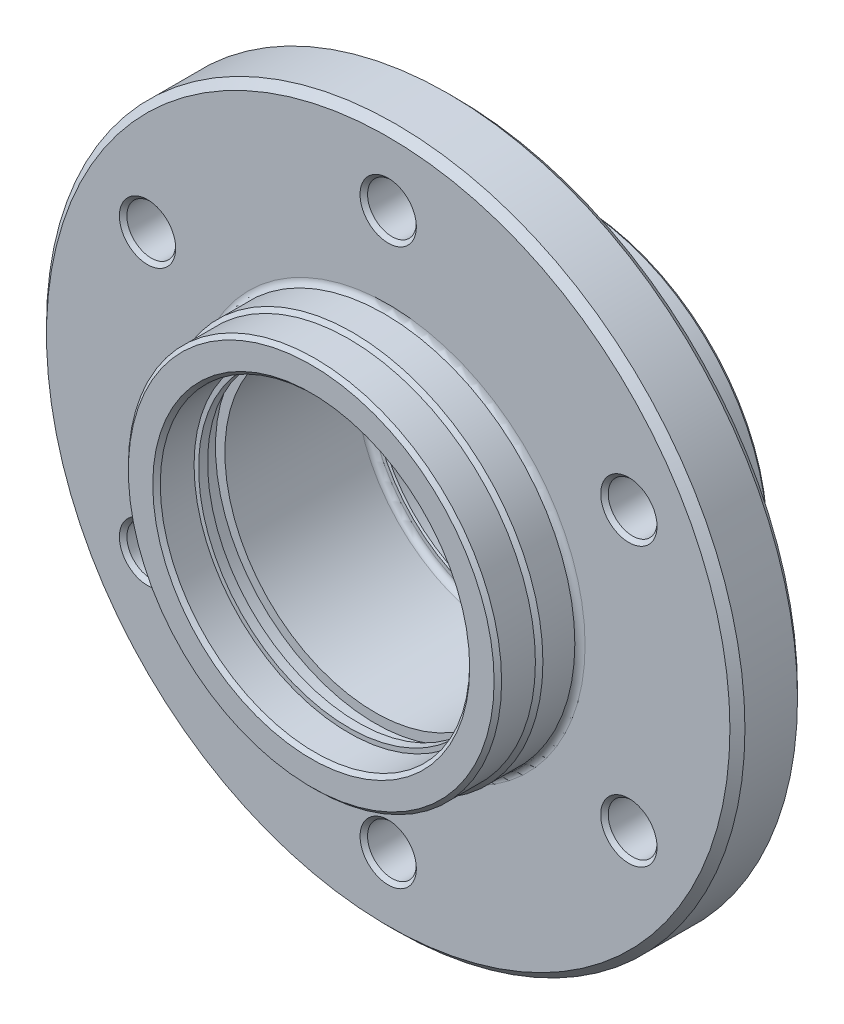
ISO-10303-21;
HEADER;
FILE_DESCRIPTION(('STEP AP214'),'2;1');
FILE_NAME('part.step','',(''),(''),'','','');
FILE_SCHEMA(('AUTOMOTIVE_DESIGN { 1 0 10303 214 1 1 1 1 }'));
ENDSEC;
DATA;
#1=APPLICATION_CONTEXT('core data for automotive mechanical design processes');
#2=APPLICATION_PROTOCOL_DEFINITION('international standard','automotive_design',2000,#1);
#3=PRODUCT_CONTEXT('',#1,'mechanical');
#4=PRODUCT('Part','Part','',(#3));
#5=PRODUCT_RELATED_PRODUCT_CATEGORY('part','',(#4));
#6=PRODUCT_DEFINITION_FORMATION('','',#4);
#7=PRODUCT_DEFINITION_CONTEXT('part definition',#1,'design');
#8=PRODUCT_DEFINITION('design','',#6,#7);
#9=PRODUCT_DEFINITION_SHAPE('','',#8);
#10=(LENGTH_UNIT() NAMED_UNIT(*) SI_UNIT(.MILLI.,.METRE.));
#11=(NAMED_UNIT(*) PLANE_ANGLE_UNIT() SI_UNIT($,.RADIAN.));
#12=(NAMED_UNIT(*) SI_UNIT($,.STERADIAN.) SOLID_ANGLE_UNIT());
#13=UNCERTAINTY_MEASURE_WITH_UNIT(LENGTH_MEASURE(1.E-05),#10,'distance_accuracy_value','');
#14=(GEOMETRIC_REPRESENTATION_CONTEXT(3) GLOBAL_UNCERTAINTY_ASSIGNED_CONTEXT((#13)) GLOBAL_UNIT_ASSIGNED_CONTEXT((#10,
#11,#12)) REPRESENTATION_CONTEXT('',''));
#15=CARTESIAN_POINT('',(0.,0.,0.));
#16=DIRECTION('',(0.,0.,1.));
#17=DIRECTION('',(1.,0.,0.));
#18=AXIS2_PLACEMENT_3D('',#15,#16,#17);
#19=CARTESIAN_POINT('',(0.,0.,9.));
#20=DIRECTION('',(0.,0.,1.));
#21=DIRECTION('',(1.,0.,0.));
#22=AXIS2_PLACEMENT_3D('',#19,#20,#21);
#23=PLANE('',#22);
#24=CARTESIAN_POINT('',(-32.0429399400237,18.4999999999991,9.));
#25=DIRECTION('',(0.,0.,1.));
#26=DIRECTION('',(1.,0.,0.));
#27=AXIS2_PLACEMENT_3D('',#24,#25,#26);
#28=CIRCLE('',#27,3.75000000000004);
#29=CARTESIAN_POINT('',(-28.2929399400237,18.4999999999991,9.));
#30=VERTEX_POINT('',#29);
#31=EDGE_CURVE('E10',#30,#30,#28,.F.);
#32=ORIENTED_EDGE('',*,*,#31,.T.);
#33=EDGE_LOOP('',(#32));
#34=FACE_BOUND('',#33,.T.);
#35=CARTESIAN_POINT('',(-32.0429399400226,-18.5000000000009,9.));
#36=DIRECTION('',(0.,0.,1.));
#37=DIRECTION('',(1.,0.,0.));
#38=AXIS2_PLACEMENT_3D('',#35,#36,#37);
#39=CIRCLE('',#38,3.75);
#40=CARTESIAN_POINT('',(-28.2929399400226,-18.5000000000009,9.));
#41=VERTEX_POINT('',#40);
#42=EDGE_CURVE('E40',#41,#41,#39,.F.);
#43=ORIENTED_EDGE('',*,*,#42,.T.);
#44=EDGE_LOOP('',(#43));
#45=FACE_BOUND('',#44,.T.);
#46=CARTESIAN_POINT('',(2.09414411153621E-12,-37.,9.));
#47=DIRECTION('',(0.,0.,1.));
#48=DIRECTION('',(1.,0.,0.));
#49=AXIS2_PLACEMENT_3D('',#46,#47,#48);
#50=CIRCLE('',#49,3.75);
#51=CARTESIAN_POINT('',(3.7500000000021,-37.,9.));
#52=VERTEX_POINT('',#51);
#53=EDGE_CURVE('E44',#52,#52,#50,.F.);
#54=ORIENTED_EDGE('',*,*,#53,.T.);
#55=EDGE_LOOP('',(#54));
#56=FACE_BOUND('',#55,.T.);
#57=CARTESIAN_POINT('',(32.0429399400258,-18.4999999999991,9.));
#58=DIRECTION('',(0.,0.,1.));
#59=DIRECTION('',(1.,0.,0.));
#60=AXIS2_PLACEMENT_3D('',#57,#58,#59);
#61=CIRCLE('',#60,3.74999999999999);
#62=CARTESIAN_POINT('',(35.7929399400258,-18.4999999999991,9.));
#63=VERTEX_POINT('',#62);
#64=EDGE_CURVE('E48',#63,#63,#61,.F.);
#65=ORIENTED_EDGE('',*,*,#64,.T.);
#66=EDGE_LOOP('',(#65));
#67=FACE_BOUND('',#66,.T.);
#68=CARTESIAN_POINT('',(32.0429399400247,18.5000000000009,9.));
#69=DIRECTION('',(0.,0.,1.));
#70=DIRECTION('',(1.,0.,0.));
#71=AXIS2_PLACEMENT_3D('',#68,#69,#70);
#72=CIRCLE('',#71,3.75000000000003);
#73=CARTESIAN_POINT('',(35.7929399400248,18.5000000000009,9.));
#74=VERTEX_POINT('',#73);
#75=EDGE_CURVE('E53',#74,#74,#72,.F.);
#76=ORIENTED_EDGE('',*,*,#75,.T.);
#77=EDGE_LOOP('',(#76));
#78=FACE_BOUND('',#77,.T.);
#79=CARTESIAN_POINT('',(0.,37.,9.));
#80=DIRECTION('',(0.,0.,1.));
#81=DIRECTION('',(1.,0.,0.));
#82=AXIS2_PLACEMENT_3D('',#79,#80,#81);
#83=CIRCLE('',#82,3.75);
#84=CARTESIAN_POINT('',(3.75,37.,9.));
#85=VERTEX_POINT('',#84);
#86=EDGE_CURVE('E56',#85,#85,#83,.F.);
#87=ORIENTED_EDGE('',*,*,#86,.T.);
#88=EDGE_LOOP('',(#87));
#89=FACE_BOUND('',#88,.T.);
#90=CARTESIAN_POINT('',(0.,0.,9.));
#91=DIRECTION('',(0.,0.,1.));
#92=DIRECTION('',(1.,0.,0.));
#93=AXIS2_PLACEMENT_3D('',#90,#91,#92);
#94=CIRCLE('',#93,45.5);
#95=CARTESIAN_POINT('',(45.5,0.,9.));
#96=VERTEX_POINT('',#95);
#97=EDGE_CURVE('E203',#96,#96,#94,.T.);
#98=ORIENTED_EDGE('',*,*,#97,.T.);
#99=EDGE_LOOP('',(#98));
#100=FACE_BOUND('',#99,.T.);
#101=CARTESIAN_POINT('',(0.,0.,9.));
#102=DIRECTION('',(0.,0.,1.));
#103=DIRECTION('',(1.,0.,0.));
#104=AXIS2_PLACEMENT_3D('',#101,#102,#103);
#105=CIRCLE('',#104,26.2160254037844);
#106=CARTESIAN_POINT('',(26.2160254037844,0.,9.));
#107=VERTEX_POINT('',#106);
#108=EDGE_CURVE('E113',#107,#107,#105,.T.);
#109=ORIENTED_EDGE('',*,*,#108,.F.);
#110=EDGE_LOOP('',(#109));
#111=FACE_BOUND('',#110,.T.);
#112=ADVANCED_FACE('F33',(#34,#45,#56,#67,#78,#89,#100,#111),#23,.T.);
#113=CARTESIAN_POINT('',(0.,0.,10.));
#114=DIRECTION('',(0.,0.,1.));
#115=DIRECTION('',(1.,0.,0.));
#116=AXIS2_PLACEMENT_3D('',#113,#114,#115);
#117=TOROIDAL_SURFACE('',#116,26.2160254037844,1.);
#118=CARTESIAN_POINT('',(0.,0.,9.50000000000002));
#119=DIRECTION('',(0.,0.,1.));
#120=DIRECTION('',(1.,0.,0.));
#121=AXIS2_PLACEMENT_3D('',#118,#119,#120);
#122=CIRCLE('',#121,25.35);
#123=CARTESIAN_POINT('',(25.35,0.,9.50000000000002));
#124=VERTEX_POINT('',#123);
#125=EDGE_CURVE('E116',#124,#124,#122,.T.);
#126=ORIENTED_EDGE('',*,*,#125,.F.);
#127=EDGE_LOOP('',(#126));
#128=FACE_BOUND('',#127,.T.);
#129=ORIENTED_EDGE('',*,*,#108,.T.);
#130=EDGE_LOOP('',(#129));
#131=FACE_BOUND('',#130,.T.);
#132=ADVANCED_FACE('F227',(#128,#131),#117,.F.);
#133=CARTESIAN_POINT('',(0.,0.,23.3026411808121));
#134=DIRECTION('',(0.,0.,1.));
#135=DIRECTION('',(1.,0.,0.));
#136=AXIS2_PLACEMENT_3D('',#133,#134,#135);
#137=CYLINDRICAL_SURFACE('',#136,25.35);
#138=ORIENTED_EDGE('',*,*,#125,.T.);
#139=EDGE_LOOP('',(#138));
#140=FACE_BOUND('',#139,.T.);
#141=CARTESIAN_POINT('',(0.,0.,13.75));
#142=DIRECTION('',(0.,0.,1.));
#143=DIRECTION('',(1.,0.,0.));
#144=AXIS2_PLACEMENT_3D('',#141,#142,#143);
#145=CIRCLE('',#144,25.35);
#146=CARTESIAN_POINT('',(25.35,0.,13.75));
#147=VERTEX_POINT('',#146);
#148=EDGE_CURVE('E119',#147,#147,#145,.T.);
#149=ORIENTED_EDGE('',*,*,#148,.F.);
#150=EDGE_LOOP('',(#149));
#151=FACE_BOUND('',#150,.T.);
#152=ADVANCED_FACE('F232',(#140,#151),#137,.T.);
#153=CARTESIAN_POINT('',(0.,0.,13.75));
#154=DIRECTION('',(0.,0.,-1.));
#155=DIRECTION('',(-1.,0.,0.));
#156=AXIS2_PLACEMENT_3D('',#153,#154,#155);
#157=CONICAL_SURFACE('',#156,25.35,0.785398163397445);
#158=CARTESIAN_POINT('',(0.,0.,14.25));
#159=DIRECTION('',(0.,0.,1.));
#160=DIRECTION('',(1.,0.,0.));
#161=AXIS2_PLACEMENT_3D('',#158,#159,#160);
#162=CIRCLE('',#161,24.85);
#163=CARTESIAN_POINT('',(24.85,0.,14.25));
#164=VERTEX_POINT('',#163);
#165=EDGE_CURVE('E122',#164,#164,#162,.T.);
#166=ORIENTED_EDGE('',*,*,#165,.F.);
#167=EDGE_LOOP('',(#166));
#168=FACE_BOUND('',#167,.T.);
#169=ORIENTED_EDGE('',*,*,#148,.T.);
#170=EDGE_LOOP('',(#169));
#171=FACE_BOUND('',#170,.T.);
#172=ADVANCED_FACE('F651',(#168,#171),#157,.T.);
#173=CARTESIAN_POINT('',(0.,0.,23.3026411808121));
#174=DIRECTION('',(0.,0.,1.));
#175=DIRECTION('',(1.,0.,0.));
#176=AXIS2_PLACEMENT_3D('',#173,#174,#175);
#177=CYLINDRICAL_SURFACE('',#176,24.85);
#178=CARTESIAN_POINT('',(0.,0.,18.75));
#179=DIRECTION('',(0.,0.,1.));
#180=DIRECTION('',(1.,0.,0.));
#181=AXIS2_PLACEMENT_3D('',#178,#179,#180);
#182=CIRCLE('',#181,24.85);
#183=CARTESIAN_POINT('',(24.85,0.,18.75));
#184=VERTEX_POINT('',#183);
#185=EDGE_CURVE('E125',#184,#184,#182,.T.);
#186=ORIENTED_EDGE('',*,*,#185,.F.);
#187=EDGE_LOOP('',(#186));
#188=FACE_BOUND('',#187,.T.);
#189=ORIENTED_EDGE('',*,*,#165,.T.);
#190=EDGE_LOOP('',(#189));
#191=FACE_BOUND('',#190,.T.);
#192=ADVANCED_FACE('F642',(#188,#191),#177,.T.);
#193=CARTESIAN_POINT('',(0.,0.,18.75));
#194=DIRECTION('',(0.,0.,-1.));
#195=DIRECTION('',(-1.,0.,0.));
#196=AXIS2_PLACEMENT_3D('',#193,#194,#195);
#197=CONICAL_SURFACE('',#196,24.85,0.785398163397448);
#198=CARTESIAN_POINT('',(0.,0.,19.25));
#199=DIRECTION('',(0.,0.,1.));
#200=DIRECTION('',(1.,0.,0.));
#201=AXIS2_PLACEMENT_3D('',#198,#199,#200);
#202=CIRCLE('',#201,24.35);
#203=CARTESIAN_POINT('',(24.35,0.,19.25));
#204=VERTEX_POINT('',#203);
#205=EDGE_CURVE('E128',#204,#204,#202,.T.);
#206=ORIENTED_EDGE('',*,*,#205,.F.);
#207=EDGE_LOOP('',(#206));
#208=FACE_BOUND('',#207,.T.);
#209=ORIENTED_EDGE('',*,*,#185,.T.);
#210=EDGE_LOOP('',(#209));
#211=FACE_BOUND('',#210,.T.);
#212=ADVANCED_FACE('F633',(#208,#211),#197,.T.);
#213=CARTESIAN_POINT('',(0.,0.,19.25));
#214=DIRECTION('',(0.,0.,1.));
#215=DIRECTION('',(1.,0.,0.));
#216=AXIS2_PLACEMENT_3D('',#213,#214,#215);
#217=PLANE('',#216);
#218=ORIENTED_EDGE('',*,*,#205,.T.);
#219=EDGE_LOOP('',(#218));
#220=FACE_BOUND('',#219,.T.);
#221=CARTESIAN_POINT('',(0.,0.,19.25));
#222=DIRECTION('',(0.,0.,1.));
#223=DIRECTION('',(1.,0.,0.));
#224=AXIS2_PLACEMENT_3D('',#221,#222,#223);
#225=CIRCLE('',#224,21.1);
#226=CARTESIAN_POINT('',(21.1,0.,19.25));
#227=VERTEX_POINT('',#226);
#228=EDGE_CURVE('E131',#227,#227,#225,.T.);
#229=ORIENTED_EDGE('',*,*,#228,.F.);
#230=EDGE_LOOP('',(#229));
#231=FACE_BOUND('',#230,.T.);
#232=ADVANCED_FACE('F624',(#220,#231),#217,.T.);
#233=CARTESIAN_POINT('',(0.,0.,18.75));
#234=DIRECTION('',(0.,0.,1.));
#235=DIRECTION('',(1.,0.,0.));
#236=AXIS2_PLACEMENT_3D('',#233,#234,#235);
#237=CONICAL_SURFACE('',#236,20.6,0.785398163397448);
#238=ORIENTED_EDGE('',*,*,#228,.T.);
#239=EDGE_LOOP('',(#238));
#240=FACE_BOUND('',#239,.T.);
#241=CARTESIAN_POINT('',(0.,0.,18.75));
#242=DIRECTION('',(0.,0.,1.));
#243=DIRECTION('',(1.,0.,0.));
#244=AXIS2_PLACEMENT_3D('',#241,#242,#243);
#245=CIRCLE('',#244,20.6);
#246=CARTESIAN_POINT('',(20.6,0.,18.75));
#247=VERTEX_POINT('',#246);
#248=EDGE_CURVE('E134',#247,#247,#245,.T.);
#249=ORIENTED_EDGE('',*,*,#248,.F.);
#250=EDGE_LOOP('',(#249));
#251=FACE_BOUND('',#250,.T.);
#252=ADVANCED_FACE('F615',(#240,#251),#237,.F.);
#253=CARTESIAN_POINT('',(0.,0.,23.3026411808121));
#254=DIRECTION('',(0.,0.,1.));
#255=DIRECTION('',(1.,0.,0.));
#256=AXIS2_PLACEMENT_3D('',#253,#254,#255);
#257=CYLINDRICAL_SURFACE('',#256,20.6);
#258=ORIENTED_EDGE('',*,*,#248,.T.);
#259=EDGE_LOOP('',(#258));
#260=FACE_BOUND('',#259,.T.);
#261=CARTESIAN_POINT('',(0.,0.,14.25));
#262=DIRECTION('',(0.,0.,1.));
#263=DIRECTION('',(1.,0.,0.));
#264=AXIS2_PLACEMENT_3D('',#261,#262,#263);
#265=CIRCLE('',#264,20.6);
#266=CARTESIAN_POINT('',(20.6,0.,14.25));
#267=VERTEX_POINT('',#266);
#268=EDGE_CURVE('E137',#267,#267,#265,.T.);
#269=ORIENTED_EDGE('',*,*,#268,.F.);
#270=EDGE_LOOP('',(#269));
#271=FACE_BOUND('',#270,.T.);
#272=ADVANCED_FACE('F606',(#260,#271),#257,.F.);
#273=CARTESIAN_POINT('',(0.,0.,14.25));
#274=DIRECTION('',(0.,0.,1.));
#275=DIRECTION('',(1.,0.,0.));
#276=AXIS2_PLACEMENT_3D('',#273,#274,#275);
#277=PLANE('',#276);
#278=ORIENTED_EDGE('',*,*,#268,.T.);
#279=EDGE_LOOP('',(#278));
#280=FACE_BOUND('',#279,.T.);
#281=CARTESIAN_POINT('',(0.,0.,14.25));
#282=DIRECTION('',(0.,0.,1.));
#283=DIRECTION('',(1.,0.,0.));
#284=AXIS2_PLACEMENT_3D('',#281,#282,#283);
#285=CIRCLE('',#284,20.);
#286=CARTESIAN_POINT('',(20.,0.,14.25));
#287=VERTEX_POINT('',#286);
#288=EDGE_CURVE('E140',#287,#287,#285,.T.);
#289=ORIENTED_EDGE('',*,*,#288,.F.);
#290=EDGE_LOOP('',(#289));
#291=FACE_BOUND('',#290,.T.);
#292=ADVANCED_FACE('F597',(#280,#291),#277,.T.);
#293=CARTESIAN_POINT('',(0.,0.,23.3026411808121));
#294=DIRECTION('',(0.,0.,1.));
#295=DIRECTION('',(1.,0.,0.));
#296=AXIS2_PLACEMENT_3D('',#293,#294,#295);
#297=CYLINDRICAL_SURFACE('',#296,20.);
#298=CARTESIAN_POINT('',(0.,0.,13.05));
#299=DIRECTION('',(0.,0.,1.));
#300=DIRECTION('',(1.,0.,0.));
#301=AXIS2_PLACEMENT_3D('',#298,#299,#300);
#302=CIRCLE('',#301,20.);
#303=CARTESIAN_POINT('',(20.,0.,13.05));
#304=VERTEX_POINT('',#303);
#305=EDGE_CURVE('E143',#304,#304,#302,.T.);
#306=ORIENTED_EDGE('',*,*,#305,.F.);
#307=EDGE_LOOP('',(#306));
#308=FACE_BOUND('',#307,.T.);
#309=ORIENTED_EDGE('',*,*,#288,.T.);
#310=EDGE_LOOP('',(#309));
#311=FACE_BOUND('',#310,.T.);
#312=ADVANCED_FACE('F588',(#308,#311),#297,.F.);
#313=CARTESIAN_POINT('',(0.,0.,13.05));
#314=DIRECTION('',(0.,0.,1.));
#315=DIRECTION('',(1.,0.,0.));
#316=AXIS2_PLACEMENT_3D('',#313,#314,#315);
#317=PLANE('',#316);
#318=CARTESIAN_POINT('',(0.,0.,13.05));
#319=DIRECTION('',(0.,0.,1.));
#320=DIRECTION('',(1.,0.,0.));
#321=AXIS2_PLACEMENT_3D('',#318,#319,#320);
#322=CIRCLE('',#321,21.25);
#323=CARTESIAN_POINT('',(21.25,0.,13.05));
#324=VERTEX_POINT('',#323);
#325=EDGE_CURVE('E146',#324,#324,#322,.T.);
#326=ORIENTED_EDGE('',*,*,#325,.F.);
#327=EDGE_LOOP('',(#326));
#328=FACE_BOUND('',#327,.T.);
#329=ORIENTED_EDGE('',*,*,#305,.T.);
#330=EDGE_LOOP('',(#329));
#331=FACE_BOUND('',#330,.T.);
#332=ADVANCED_FACE('F579',(#328,#331),#317,.F.);
#333=CARTESIAN_POINT('',(0.,0.,23.3026411808121));
#334=DIRECTION('',(0.,0.,1.));
#335=DIRECTION('',(1.,0.,0.));
#336=AXIS2_PLACEMENT_3D('',#333,#334,#335);
#337=CYLINDRICAL_SURFACE('',#336,21.25);
#338=CARTESIAN_POINT('',(0.,0.,10.75));
#339=DIRECTION('',(0.,0.,1.));
#340=DIRECTION('',(1.,0.,0.));
#341=AXIS2_PLACEMENT_3D('',#338,#339,#340);
#342=CIRCLE('',#341,21.25);
#343=CARTESIAN_POINT('',(21.25,0.,10.75));
#344=VERTEX_POINT('',#343);
#345=EDGE_CURVE('E149',#344,#344,#342,.T.);
#346=ORIENTED_EDGE('',*,*,#345,.F.);
#347=EDGE_LOOP('',(#346));
#348=FACE_BOUND('',#347,.T.);
#349=ORIENTED_EDGE('',*,*,#325,.T.);
#350=EDGE_LOOP('',(#349));
#351=FACE_BOUND('',#350,.T.);
#352=ADVANCED_FACE('F570',(#348,#351),#337,.F.);
#353=CARTESIAN_POINT('',(0.,0.,10.75));
#354=DIRECTION('',(0.,0.,-1.));
#355=DIRECTION('',(-1.,0.,0.));
#356=AXIS2_PLACEMENT_3D('',#353,#354,#355);
#357=PLANE('',#356);
#358=CARTESIAN_POINT('',(0.,0.,10.75));
#359=DIRECTION('',(0.,0.,1.));
#360=DIRECTION('',(1.,0.,0.));
#361=AXIS2_PLACEMENT_3D('',#358,#359,#360);
#362=CIRCLE('',#361,20.);
#363=CARTESIAN_POINT('',(20.,0.,10.75));
#364=VERTEX_POINT('',#363);
#365=EDGE_CURVE('E152',#364,#364,#362,.T.);
#366=ORIENTED_EDGE('',*,*,#365,.F.);
#367=EDGE_LOOP('',(#366));
#368=FACE_BOUND('',#367,.T.);
#369=ORIENTED_EDGE('',*,*,#345,.T.);
#370=EDGE_LOOP('',(#369));
#371=FACE_BOUND('',#370,.T.);
#372=ADVANCED_FACE('F561',(#368,#371),#357,.F.);
#373=CARTESIAN_POINT('',(0.,0.,23.3026411808121));
#374=DIRECTION('',(0.,0.,1.));
#375=DIRECTION('',(1.,0.,0.));
#376=AXIS2_PLACEMENT_3D('',#373,#374,#375);
#377=CYLINDRICAL_SURFACE('',#376,20.);
#378=CARTESIAN_POINT('',(0.,0.,-6.65));
#379=DIRECTION('',(0.,0.,1.));
#380=DIRECTION('',(1.,0.,0.));
#381=AXIS2_PLACEMENT_3D('',#378,#379,#380);
#382=CIRCLE('',#381,20.);
#383=CARTESIAN_POINT('',(20.,0.,-6.65));
#384=VERTEX_POINT('',#383);
#385=EDGE_CURVE('E155',#384,#384,#382,.T.);
#386=ORIENTED_EDGE('',*,*,#385,.F.);
#387=EDGE_LOOP('',(#386));
#388=FACE_BOUND('',#387,.T.);
#389=ORIENTED_EDGE('',*,*,#365,.T.);
#390=EDGE_LOOP('',(#389));
#391=FACE_BOUND('',#390,.T.);
#392=ADVANCED_FACE('F552',(#388,#391),#377,.F.);
#393=CARTESIAN_POINT('',(0.,0.,-6.65));
#394=DIRECTION('',(0.,0.,1.));
#395=DIRECTION('',(1.,0.,0.));
#396=AXIS2_PLACEMENT_3D('',#393,#394,#395);
#397=TOROIDAL_SURFACE('',#396,19.2,0.799999999999998);
#398=ORIENTED_EDGE('',*,*,#385,.T.);
#399=EDGE_LOOP('',(#398));
#400=FACE_BOUND('',#399,.T.);
#401=CARTESIAN_POINT('',(0.,0.,-7.45));
#402=DIRECTION('',(0.,0.,1.));
#403=DIRECTION('',(1.,0.,0.));
#404=AXIS2_PLACEMENT_3D('',#401,#402,#403);
#405=CIRCLE('',#404,19.2);
#406=CARTESIAN_POINT('',(19.2,0.,-7.45));
#407=VERTEX_POINT('',#406);
#408=EDGE_CURVE('E158',#407,#407,#405,.T.);
#409=ORIENTED_EDGE('',*,*,#408,.F.);
#410=EDGE_LOOP('',(#409));
#411=FACE_BOUND('',#410,.T.);
#412=ADVANCED_FACE('F543',(#400,#411),#397,.F.);
#413=CARTESIAN_POINT('',(0.,0.,-7.45));
#414=DIRECTION('',(0.,0.,1.));
#415=DIRECTION('',(1.,0.,0.));
#416=AXIS2_PLACEMENT_3D('',#413,#414,#415);
#417=PLANE('',#416);
#418=ORIENTED_EDGE('',*,*,#408,.T.);
#419=EDGE_LOOP('',(#418));
#420=FACE_BOUND('',#419,.T.);
#421=CARTESIAN_POINT('',(0.,0.,-7.45));
#422=DIRECTION('',(0.,0.,1.));
#423=DIRECTION('',(1.,0.,0.));
#424=AXIS2_PLACEMENT_3D('',#421,#422,#423);
#425=CIRCLE('',#424,18.7);
#426=CARTESIAN_POINT('',(18.7,0.,-7.45));
#427=VERTEX_POINT('',#426);
#428=EDGE_CURVE('E161',#427,#427,#425,.T.);
#429=ORIENTED_EDGE('',*,*,#428,.F.);
#430=EDGE_LOOP('',(#429));
#431=FACE_BOUND('',#430,.T.);
#432=ADVANCED_FACE('F534',(#420,#431),#417,.T.);
#433=CARTESIAN_POINT('',(0.,0.,-7.45));
#434=DIRECTION('',(0.,0.,1.));
#435=DIRECTION('',(1.,0.,0.));
#436=AXIS2_PLACEMENT_3D('',#433,#434,#435);
#437=CONICAL_SURFACE('',#436,18.7,0.785398163397448);
#438=CARTESIAN_POINT('',(0.,0.,-7.65));
#439=DIRECTION('',(0.,0.,1.));
#440=DIRECTION('',(1.,0.,0.));
#441=AXIS2_PLACEMENT_3D('',#438,#439,#440);
#442=CIRCLE('',#441,18.5);
#443=CARTESIAN_POINT('',(18.5,0.,-7.65));
#444=VERTEX_POINT('',#443);
#445=EDGE_CURVE('E164',#444,#444,#442,.T.);
#446=ORIENTED_EDGE('',*,*,#445,.F.);
#447=EDGE_LOOP('',(#446));
#448=FACE_BOUND('',#447,.T.);
#449=ORIENTED_EDGE('',*,*,#428,.T.);
#450=EDGE_LOOP('',(#449));
#451=FACE_BOUND('',#450,.T.);
#452=ADVANCED_FACE('F525',(#448,#451),#437,.F.);
#453=CARTESIAN_POINT('',(0.,0.,23.3026411808121));
#454=DIRECTION('',(0.,0.,1.));
#455=DIRECTION('',(1.,0.,0.));
#456=AXIS2_PLACEMENT_3D('',#453,#454,#455);
#457=CYLINDRICAL_SURFACE('',#456,18.5);
#458=CARTESIAN_POINT('',(0.,0.,-10.75));
#459=DIRECTION('',(0.,0.,1.));
#460=DIRECTION('',(1.,0.,0.));
#461=AXIS2_PLACEMENT_3D('',#458,#459,#460);
#462=CIRCLE('',#461,18.5);
#463=CARTESIAN_POINT('',(18.5,0.,-10.75));
#464=VERTEX_POINT('',#463);
#465=EDGE_CURVE('E167',#464,#464,#462,.T.);
#466=ORIENTED_EDGE('',*,*,#465,.F.);
#467=EDGE_LOOP('',(#466));
#468=FACE_BOUND('',#467,.T.);
#469=ORIENTED_EDGE('',*,*,#445,.T.);
#470=EDGE_LOOP('',(#469));
#471=FACE_BOUND('',#470,.T.);
#472=ADVANCED_FACE('F516',(#468,#471),#457,.F.);
#473=CARTESIAN_POINT('',(0.,0.,-10.95));
#474=DIRECTION('',(0.,0.,-1.));
#475=DIRECTION('',(-1.,0.,0.));
#476=AXIS2_PLACEMENT_3D('',#473,#474,#475);
#477=CONICAL_SURFACE('',#476,18.7,0.785398163397396);
#478=ORIENTED_EDGE('',*,*,#465,.T.);
#479=EDGE_LOOP('',(#478));
#480=FACE_BOUND('',#479,.T.);
#481=CARTESIAN_POINT('',(0.,0.,-10.95));
#482=DIRECTION('',(0.,0.,1.));
#483=DIRECTION('',(1.,0.,0.));
#484=AXIS2_PLACEMENT_3D('',#481,#482,#483);
#485=CIRCLE('',#484,18.7);
#486=CARTESIAN_POINT('',(18.7,0.,-10.95));
#487=VERTEX_POINT('',#486);
#488=EDGE_CURVE('E170',#487,#487,#485,.T.);
#489=ORIENTED_EDGE('',*,*,#488,.F.);
#490=EDGE_LOOP('',(#489));
#491=FACE_BOUND('',#490,.T.);
#492=ADVANCED_FACE('F507',(#480,#491),#477,.F.);
#493=CARTESIAN_POINT('',(0.,0.,-10.95));
#494=DIRECTION('',(0.,0.,1.));
#495=DIRECTION('',(1.,0.,0.));
#496=AXIS2_PLACEMENT_3D('',#493,#494,#495);
#497=PLANE('',#496);
#498=CARTESIAN_POINT('',(0.,0.,-10.95));
#499=DIRECTION('',(0.,0.,1.));
#500=DIRECTION('',(1.,0.,0.));
#501=AXIS2_PLACEMENT_3D('',#498,#499,#500);
#502=CIRCLE('',#501,20.6);
#503=CARTESIAN_POINT('',(20.6,0.,-10.95));
#504=VERTEX_POINT('',#503);
#505=EDGE_CURVE('E173',#504,#504,#502,.T.);
#506=ORIENTED_EDGE('',*,*,#505,.F.);
#507=EDGE_LOOP('',(#506));
#508=FACE_BOUND('',#507,.T.);
#509=ORIENTED_EDGE('',*,*,#488,.T.);
#510=EDGE_LOOP('',(#509));
#511=FACE_BOUND('',#510,.T.);
#512=ADVANCED_FACE('F498',(#508,#511),#497,.F.);
#513=CARTESIAN_POINT('',(0.,0.,23.3026411808121));
#514=DIRECTION('',(0.,0.,1.));
#515=DIRECTION('',(1.,0.,0.));
#516=AXIS2_PLACEMENT_3D('',#513,#514,#515);
#517=CYLINDRICAL_SURFACE('',#516,20.6);
#518=CARTESIAN_POINT('',(0.,0.,-15.45));
#519=DIRECTION('',(0.,0.,1.));
#520=DIRECTION('',(1.,0.,0.));
#521=AXIS2_PLACEMENT_3D('',#518,#519,#520);
#522=CIRCLE('',#521,20.6);
#523=CARTESIAN_POINT('',(20.6,0.,-15.45));
#524=VERTEX_POINT('',#523);
#525=EDGE_CURVE('E176',#524,#524,#522,.T.);
#526=ORIENTED_EDGE('',*,*,#525,.F.);
#527=EDGE_LOOP('',(#526));
#528=FACE_BOUND('',#527,.T.);
#529=ORIENTED_EDGE('',*,*,#505,.T.);
#530=EDGE_LOOP('',(#529));
#531=FACE_BOUND('',#530,.T.);
#532=ADVANCED_FACE('F489',(#528,#531),#517,.F.);
#533=CARTESIAN_POINT('',(0.,0.,-15.45));
#534=DIRECTION('',(0.,0.,-1.));
#535=DIRECTION('',(-1.,0.,0.));
#536=AXIS2_PLACEMENT_3D('',#533,#534,#535);
#537=CONICAL_SURFACE('',#536,20.6,0.785398163397445);
#538=CARTESIAN_POINT('',(0.,0.,-15.95));
#539=DIRECTION('',(0.,0.,1.));
#540=DIRECTION('',(1.,0.,0.));
#541=AXIS2_PLACEMENT_3D('',#538,#539,#540);
#542=CIRCLE('',#541,21.1);
#543=CARTESIAN_POINT('',(21.1,0.,-15.95));
#544=VERTEX_POINT('',#543);
#545=EDGE_CURVE('E179',#544,#544,#542,.T.);
#546=ORIENTED_EDGE('',*,*,#545,.F.);
#547=EDGE_LOOP('',(#546));
#548=FACE_BOUND('',#547,.T.);
#549=ORIENTED_EDGE('',*,*,#525,.T.);
#550=EDGE_LOOP('',(#549));
#551=FACE_BOUND('',#550,.T.);
#552=ADVANCED_FACE('F480',(#548,#551),#537,.F.);
#553=CARTESIAN_POINT('',(0.,0.,-15.95));
#554=DIRECTION('',(0.,0.,1.));
#555=DIRECTION('',(1.,0.,0.));
#556=AXIS2_PLACEMENT_3D('',#553,#554,#555);
#557=PLANE('',#556);
#558=CARTESIAN_POINT('',(0.,0.,-15.95));
#559=DIRECTION('',(0.,0.,1.));
#560=DIRECTION('',(1.,0.,0.));
#561=AXIS2_PLACEMENT_3D('',#558,#559,#560);
#562=CIRCLE('',#561,25.5);
#563=CARTESIAN_POINT('',(25.5,0.,-15.95));
#564=VERTEX_POINT('',#563);
#565=EDGE_CURVE('E182',#564,#564,#562,.T.);
#566=ORIENTED_EDGE('',*,*,#565,.F.);
#567=EDGE_LOOP('',(#566));
#568=FACE_BOUND('',#567,.T.);
#569=ORIENTED_EDGE('',*,*,#545,.T.);
#570=EDGE_LOOP('',(#569));
#571=FACE_BOUND('',#570,.T.);
#572=ADVANCED_FACE('F471',(#568,#571),#557,.F.);
#573=CARTESIAN_POINT('',(0.,0.,-15.45));
#574=DIRECTION('',(0.,0.,1.));
#575=DIRECTION('',(1.,0.,0.));
#576=AXIS2_PLACEMENT_3D('',#573,#574,#575);
#577=CONICAL_SURFACE('',#576,26.,0.785398163397448);
#578=ORIENTED_EDGE('',*,*,#565,.T.);
#579=EDGE_LOOP('',(#578));
#580=FACE_BOUND('',#579,.T.);
#581=CARTESIAN_POINT('',(0.,0.,-15.45));
#582=DIRECTION('',(0.,0.,1.));
#583=DIRECTION('',(1.,0.,0.));
#584=AXIS2_PLACEMENT_3D('',#581,#582,#583);
#585=CIRCLE('',#584,26.);
#586=CARTESIAN_POINT('',(26.,0.,-15.45));
#587=VERTEX_POINT('',#586);
#588=EDGE_CURVE('E185',#587,#587,#585,.T.);
#589=ORIENTED_EDGE('',*,*,#588,.F.);
#590=EDGE_LOOP('',(#589));
#591=FACE_BOUND('',#590,.T.);
#592=ADVANCED_FACE('F462',(#580,#591),#577,.T.);
#593=CARTESIAN_POINT('',(0.,0.,23.3026411808121));
#594=DIRECTION('',(0.,0.,1.));
#595=DIRECTION('',(1.,0.,0.));
#596=AXIS2_PLACEMENT_3D('',#593,#594,#595);
#597=CYLINDRICAL_SURFACE('',#596,26.);
#598=ORIENTED_EDGE('',*,*,#588,.T.);
#599=EDGE_LOOP('',(#598));
#600=FACE_BOUND('',#599,.T.);
#601=CARTESIAN_POINT('',(0.,0.,-0.600000000000003));
#602=DIRECTION('',(0.,0.,1.));
#603=DIRECTION('',(1.,0.,0.));
#604=AXIS2_PLACEMENT_3D('',#601,#602,#603);
#605=CIRCLE('',#604,26.);
#606=CARTESIAN_POINT('',(26.,0.,-0.600000000000003));
#607=VERTEX_POINT('',#606);
#608=EDGE_CURVE('E188',#607,#607,#605,.T.);
#609=ORIENTED_EDGE('',*,*,#608,.F.);
#610=EDGE_LOOP('',(#609));
#611=FACE_BOUND('',#610,.T.);
#612=ADVANCED_FACE('F453',(#600,#611),#597,.T.);
#613=CARTESIAN_POINT('',(0.,0.,-0.300000000000002));
#614=DIRECTION('',(0.,0.,1.));
#615=DIRECTION('',(1.,0.,0.));
#616=AXIS2_PLACEMENT_3D('',#613,#614,#615);
#617=TOROIDAL_SURFACE('',#616,26.,0.3);
#618=ORIENTED_EDGE('',*,*,#608,.T.);
#619=EDGE_LOOP('',(#618));
#620=FACE_BOUND('',#619,.T.);
#621=CARTESIAN_POINT('',(0.,0.,0.));
#622=DIRECTION('',(0.,0.,1.));
#623=DIRECTION('',(1.,0.,0.));
#624=AXIS2_PLACEMENT_3D('',#621,#622,#623);
#625=CIRCLE('',#624,26.);
#626=CARTESIAN_POINT('',(26.,0.,0.));
#627=VERTEX_POINT('',#626);
#628=EDGE_CURVE('E191',#627,#627,#625,.T.);
#629=ORIENTED_EDGE('',*,*,#628,.F.);
#630=EDGE_LOOP('',(#629));
#631=FACE_BOUND('',#630,.T.);
#632=ADVANCED_FACE('F445',(#620,#631),#617,.F.);
#633=CARTESIAN_POINT('',(0.,0.,0.));
#634=DIRECTION('',(0.,0.,-1.));
#635=DIRECTION('',(-1.,0.,0.));
#636=AXIS2_PLACEMENT_3D('',#633,#634,#635);
#637=PLANE('',#636);
#638=CARTESIAN_POINT('',(-32.0429399400226,-18.5000000000009,0.));
#639=DIRECTION('',(0.,0.,-1.));
#640=DIRECTION('',(-1.,0.,0.));
#641=AXIS2_PLACEMENT_3D('',#638,#639,#640);
#642=CIRCLE('',#641,3.75000000000001);
#643=CARTESIAN_POINT('',(-35.7929399400227,-18.5000000000009,0.));
#644=VERTEX_POINT('',#643);
#645=EDGE_CURVE('E89',#644,#644,#642,.F.);
#646=ORIENTED_EDGE('',*,*,#645,.T.);
#647=EDGE_LOOP('',(#646));
#648=FACE_BOUND('',#647,.T.);
#649=CARTESIAN_POINT('',(2.09414411153621E-12,-37.,0.));
#650=DIRECTION('',(0.,0.,-1.));
#651=DIRECTION('',(-1.,0.,0.));
#652=AXIS2_PLACEMENT_3D('',#649,#650,#651);
#653=CIRCLE('',#652,3.75000000000001);
#654=CARTESIAN_POINT('',(-3.74999999999792,-37.,0.));
#655=VERTEX_POINT('',#654);
#656=EDGE_CURVE('E92',#655,#655,#653,.F.);
#657=ORIENTED_EDGE('',*,*,#656,.T.);
#658=EDGE_LOOP('',(#657));
#659=FACE_BOUND('',#658,.T.);
#660=CARTESIAN_POINT('',(32.0429399400258,-18.4999999999991,0.));
#661=DIRECTION('',(0.,0.,-1.));
#662=DIRECTION('',(-1.,0.,0.));
#663=AXIS2_PLACEMENT_3D('',#660,#661,#662);
#664=CIRCLE('',#663,3.75000000000001);
#665=CARTESIAN_POINT('',(28.2929399400258,-18.4999999999991,0.));
#666=VERTEX_POINT('',#665);
#667=EDGE_CURVE('E95',#666,#666,#664,.F.);
#668=ORIENTED_EDGE('',*,*,#667,.T.);
#669=EDGE_LOOP('',(#668));
#670=FACE_BOUND('',#669,.T.);
#671=CARTESIAN_POINT('',(32.0429399400247,18.5000000000009,0.));
#672=DIRECTION('',(0.,0.,-1.));
#673=DIRECTION('',(-1.,0.,0.));
#674=AXIS2_PLACEMENT_3D('',#671,#672,#673);
#675=CIRCLE('',#674,3.75000000000001);
#676=CARTESIAN_POINT('',(28.2929399400247,18.5000000000009,0.));
#677=VERTEX_POINT('',#676);
#678=EDGE_CURVE('E98',#677,#677,#675,.F.);
#679=ORIENTED_EDGE('',*,*,#678,.T.);
#680=EDGE_LOOP('',(#679));
#681=FACE_BOUND('',#680,.T.);
#682=CARTESIAN_POINT('',(0.,37.,0.));
#683=DIRECTION('',(0.,0.,-1.));
#684=DIRECTION('',(-1.,0.,0.));
#685=AXIS2_PLACEMENT_3D('',#682,#683,#684);
#686=CIRCLE('',#685,3.75000000000001);
#687=CARTESIAN_POINT('',(-3.75000000000001,37.,0.));
#688=VERTEX_POINT('',#687);
#689=EDGE_CURVE('E101',#688,#688,#686,.F.);
#690=ORIENTED_EDGE('',*,*,#689,.T.);
#691=EDGE_LOOP('',(#690));
#692=FACE_BOUND('',#691,.T.);
#693=CARTESIAN_POINT('',(-32.0429399400237,18.4999999999991,0.));
#694=DIRECTION('',(0.,0.,-1.));
#695=DIRECTION('',(-1.,0.,0.));
#696=AXIS2_PLACEMENT_3D('',#693,#694,#695);
#697=CIRCLE('',#696,3.75000000000001);
#698=CARTESIAN_POINT('',(-35.7929399400237,18.4999999999991,0.));
#699=VERTEX_POINT('',#698);
#700=EDGE_CURVE('E104',#699,#699,#697,.F.);
#701=ORIENTED_EDGE('',*,*,#700,.T.);
#702=EDGE_LOOP('',(#701));
#703=FACE_BOUND('',#702,.T.);
#704=ORIENTED_EDGE('',*,*,#628,.T.);
#705=EDGE_LOOP('',(#704));
#706=FACE_BOUND('',#705,.T.);
#707=CARTESIAN_POINT('',(0.,0.,0.));
#708=DIRECTION('',(0.,0.,1.));
#709=DIRECTION('',(1.,0.,0.));
#710=AXIS2_PLACEMENT_3D('',#707,#708,#709);
#711=CIRCLE('',#710,45.5);
#712=CARTESIAN_POINT('',(45.5,0.,0.));
#713=VERTEX_POINT('',#712);
#714=EDGE_CURVE('E194',#713,#713,#711,.T.);
#715=ORIENTED_EDGE('',*,*,#714,.F.);
#716=EDGE_LOOP('',(#715));
#717=FACE_BOUND('',#716,.T.);
#718=ADVANCED_FACE('F436',(#648,#659,#670,#681,#692,#703,#706,#717),#637,.T.);
#719=CARTESIAN_POINT('',(0.,0.,0.999999999999997));
#720=DIRECTION('',(0.,0.,1.));
#721=DIRECTION('',(1.,0.,0.));
#722=AXIS2_PLACEMENT_3D('',#719,#720,#721);
#723=CONICAL_SURFACE('',#722,46.5,0.78539816339745);
#724=ORIENTED_EDGE('',*,*,#714,.T.);
#725=EDGE_LOOP('',(#724));
#726=FACE_BOUND('',#725,.T.);
#727=CARTESIAN_POINT('',(0.,0.,0.999999999999997));
#728=DIRECTION('',(0.,0.,1.));
#729=DIRECTION('',(1.,0.,0.));
#730=AXIS2_PLACEMENT_3D('',#727,#728,#729);
#731=CIRCLE('',#730,46.5);
#732=CARTESIAN_POINT('',(46.5,0.,0.999999999999997));
#733=VERTEX_POINT('',#732);
#734=EDGE_CURVE('E197',#733,#733,#731,.T.);
#735=ORIENTED_EDGE('',*,*,#734,.F.);
#736=EDGE_LOOP('',(#735));
#737=FACE_BOUND('',#736,.T.);
#738=ADVANCED_FACE('F222',(#726,#737),#723,.T.);
#739=CARTESIAN_POINT('',(0.,0.,23.3026411808121));
#740=DIRECTION('',(0.,0.,1.));
#741=DIRECTION('',(1.,0.,0.));
#742=AXIS2_PLACEMENT_3D('',#739,#740,#741);
#743=CYLINDRICAL_SURFACE('',#742,46.5);
#744=ORIENTED_EDGE('',*,*,#734,.T.);
#745=EDGE_LOOP('',(#744));
#746=FACE_BOUND('',#745,.T.);
#747=CARTESIAN_POINT('',(0.,0.,8.));
#748=DIRECTION('',(0.,0.,1.));
#749=DIRECTION('',(1.,0.,0.));
#750=AXIS2_PLACEMENT_3D('',#747,#748,#749);
#751=CIRCLE('',#750,46.5);
#752=CARTESIAN_POINT('',(46.5,0.,8.));
#753=VERTEX_POINT('',#752);
#754=EDGE_CURVE('E200',#753,#753,#751,.T.);
#755=ORIENTED_EDGE('',*,*,#754,.F.);
#756=EDGE_LOOP('',(#755));
#757=FACE_BOUND('',#756,.T.);
#758=ADVANCED_FACE('F212',(#746,#757),#743,.T.);
#759=CARTESIAN_POINT('',(0.,0.,9.));
#760=DIRECTION('',(0.,0.,-1.));
#761=DIRECTION('',(-1.,0.,0.));
#762=AXIS2_PLACEMENT_3D('',#759,#760,#761);
#763=CONICAL_SURFACE('',#762,45.5,0.785398163397449);
#764=ORIENTED_EDGE('',*,*,#754,.T.);
#765=EDGE_LOOP('',(#764));
#766=FACE_BOUND('',#765,.T.);
#767=ORIENTED_EDGE('',*,*,#97,.F.);
#768=EDGE_LOOP('',(#767));
#769=FACE_BOUND('',#768,.T.);
#770=ADVANCED_FACE('F209',(#766,#769),#763,.T.);
#771=CARTESIAN_POINT('',(32.0429399400247,18.5000000000009,-15.95));
#772=DIRECTION('',(0.,0.,1.));
#773=DIRECTION('',(1.,0.,0.));
#774=AXIS2_PLACEMENT_3D('',#771,#772,#773);
#775=CYLINDRICAL_SURFACE('',#774,3.25);
#776=CARTESIAN_POINT('',(32.0429399400247,18.5000000000009,0.5));
#777=DIRECTION('',(0.,0.,-1.));
#778=DIRECTION('',(-1.,0.,0.));
#779=AXIS2_PLACEMENT_3D('',#776,#777,#778);
#780=CIRCLE('',#779,3.25);
#781=CARTESIAN_POINT('',(28.7929399400247,18.5000000000009,0.5));
#782=VERTEX_POINT('',#781);
#783=EDGE_CURVE('E71',#782,#782,#780,.T.);
#784=ORIENTED_EDGE('',*,*,#783,.T.);
#785=EDGE_LOOP('',(#784));
#786=FACE_BOUND('',#785,.T.);
#787=CARTESIAN_POINT('',(32.0429399400247,18.5000000000009,8.49999999999997));
#788=DIRECTION('',(0.,0.,1.));
#789=DIRECTION('',(1.,0.,0.));
#790=AXIS2_PLACEMENT_3D('',#787,#788,#789);
#791=CIRCLE('',#790,3.25);
#792=CARTESIAN_POINT('',(35.2929399400247,18.5000000000009,8.49999999999997));
#793=VERTEX_POINT('',#792);
#794=EDGE_CURVE('E74',#793,#793,#791,.T.);
#795=ORIENTED_EDGE('',*,*,#794,.T.);
#796=EDGE_LOOP('',(#795));
#797=FACE_BOUND('',#796,.T.);
#798=ADVANCED_FACE('F211',(#786,#797),#775,.F.);
#799=CARTESIAN_POINT('',(32.0429399400258,-18.4999999999991,-15.95));
#800=DIRECTION('',(0.,0.,1.));
#801=DIRECTION('',(1.,0.,0.));
#802=AXIS2_PLACEMENT_3D('',#799,#800,#801);
#803=CYLINDRICAL_SURFACE('',#802,3.25);
#804=CARTESIAN_POINT('',(32.0429399400258,-18.4999999999991,0.5));
#805=DIRECTION('',(0.,0.,-1.));
#806=DIRECTION('',(-1.,0.,0.));
#807=AXIS2_PLACEMENT_3D('',#804,#805,#806);
#808=CIRCLE('',#807,3.25);
#809=CARTESIAN_POINT('',(28.7929399400258,-18.4999999999991,0.5));
#810=VERTEX_POINT('',#809);
#811=EDGE_CURVE('E77',#810,#810,#808,.T.);
#812=ORIENTED_EDGE('',*,*,#811,.T.);
#813=EDGE_LOOP('',(#812));
#814=FACE_BOUND('',#813,.T.);
#815=CARTESIAN_POINT('',(32.0429399400258,-18.4999999999991,8.50000000000001));
#816=DIRECTION('',(0.,0.,1.));
#817=DIRECTION('',(1.,0.,0.));
#818=AXIS2_PLACEMENT_3D('',#815,#816,#817);
#819=CIRCLE('',#818,3.25);
#820=CARTESIAN_POINT('',(35.2929399400258,-18.4999999999991,8.50000000000001));
#821=VERTEX_POINT('',#820);
#822=EDGE_CURVE('E80',#821,#821,#819,.T.);
#823=ORIENTED_EDGE('',*,*,#822,.T.);
#824=EDGE_LOOP('',(#823));
#825=FACE_BOUND('',#824,.T.);
#826=ADVANCED_FACE('F219',(#814,#825),#803,.F.);
#827=CARTESIAN_POINT('',(2.09414411153621E-12,-37.,-15.95));
#828=DIRECTION('',(0.,0.,1.));
#829=DIRECTION('',(1.,0.,0.));
#830=AXIS2_PLACEMENT_3D('',#827,#828,#829);
#831=CYLINDRICAL_SURFACE('',#830,3.25);
#832=CARTESIAN_POINT('',(2.09414411153621E-12,-37.,0.5));
#833=DIRECTION('',(0.,0.,-1.));
#834=DIRECTION('',(-1.,0.,0.));
#835=AXIS2_PLACEMENT_3D('',#832,#833,#834);
#836=CIRCLE('',#835,3.25);
#837=CARTESIAN_POINT('',(-3.24999999999791,-37.,0.5));
#838=VERTEX_POINT('',#837);
#839=EDGE_CURVE('E83',#838,#838,#836,.T.);
#840=ORIENTED_EDGE('',*,*,#839,.T.);
#841=EDGE_LOOP('',(#840));
#842=FACE_BOUND('',#841,.T.);
#843=CARTESIAN_POINT('',(2.09414411153621E-12,-37.,8.5));
#844=DIRECTION('',(0.,0.,1.));
#845=DIRECTION('',(1.,0.,0.));
#846=AXIS2_PLACEMENT_3D('',#843,#844,#845);
#847=CIRCLE('',#846,3.25);
#848=CARTESIAN_POINT('',(3.25000000000209,-37.,8.5));
#849=VERTEX_POINT('',#848);
#850=EDGE_CURVE('E86',#849,#849,#847,.T.);
#851=ORIENTED_EDGE('',*,*,#850,.T.);
#852=EDGE_LOOP('',(#851));
#853=FACE_BOUND('',#852,.T.);
#854=ADVANCED_FACE('F307',(#842,#853),#831,.F.);
#855=CARTESIAN_POINT('',(-32.0429399400226,-18.5000000000009,-15.95));
#856=DIRECTION('',(0.,0.,1.));
#857=DIRECTION('',(1.,0.,0.));
#858=AXIS2_PLACEMENT_3D('',#855,#856,#857);
#859=CYLINDRICAL_SURFACE('',#858,3.25);
#860=CARTESIAN_POINT('',(-32.0429399400226,-18.5000000000009,0.5));
#861=DIRECTION('',(0.,0.,-1.));
#862=DIRECTION('',(-1.,0.,0.));
#863=AXIS2_PLACEMENT_3D('',#860,#861,#862);
#864=CIRCLE('',#863,3.25);
#865=CARTESIAN_POINT('',(-35.2929399400227,-18.5000000000009,0.5));
#866=VERTEX_POINT('',#865);
#867=EDGE_CURVE('E107',#866,#866,#864,.T.);
#868=ORIENTED_EDGE('',*,*,#867,.T.);
#869=EDGE_LOOP('',(#868));
#870=FACE_BOUND('',#869,.T.);
#871=CARTESIAN_POINT('',(-32.0429399400226,-18.5000000000009,8.5));
#872=DIRECTION('',(0.,0.,1.));
#873=DIRECTION('',(1.,0.,0.));
#874=AXIS2_PLACEMENT_3D('',#871,#872,#873);
#875=CIRCLE('',#874,3.25);
#876=CARTESIAN_POINT('',(-28.7929399400226,-18.5000000000009,8.5));
#877=VERTEX_POINT('',#876);
#878=EDGE_CURVE('E110',#877,#877,#875,.T.);
#879=ORIENTED_EDGE('',*,*,#878,.T.);
#880=EDGE_LOOP('',(#879));
#881=FACE_BOUND('',#880,.T.);
#882=ADVANCED_FACE('F301',(#870,#881),#859,.F.);
#883=CARTESIAN_POINT('',(-32.0429399400237,18.4999999999991,-15.95));
#884=DIRECTION('',(0.,0.,1.));
#885=DIRECTION('',(1.,0.,0.));
#886=AXIS2_PLACEMENT_3D('',#883,#884,#885);
#887=CYLINDRICAL_SURFACE('',#886,3.25);
#888=CARTESIAN_POINT('',(-32.0429399400237,18.4999999999991,0.5));
#889=DIRECTION('',(0.,0.,-1.));
#890=DIRECTION('',(-1.,0.,0.));
#891=AXIS2_PLACEMENT_3D('',#888,#889,#890);
#892=CIRCLE('',#891,3.25);
#893=CARTESIAN_POINT('',(-35.2929399400237,18.4999999999991,0.5));
#894=VERTEX_POINT('',#893);
#895=EDGE_CURVE('E59',#894,#894,#892,.T.);
#896=ORIENTED_EDGE('',*,*,#895,.T.);
#897=EDGE_LOOP('',(#896));
#898=FACE_BOUND('',#897,.T.);
#899=CARTESIAN_POINT('',(-32.0429399400237,18.4999999999991,8.49999999999996));
#900=DIRECTION('',(0.,0.,1.));
#901=DIRECTION('',(1.,0.,0.));
#902=AXIS2_PLACEMENT_3D('',#899,#900,#901);
#903=CIRCLE('',#902,3.25);
#904=CARTESIAN_POINT('',(-28.7929399400237,18.4999999999991,8.49999999999996));
#905=VERTEX_POINT('',#904);
#906=EDGE_CURVE('E62',#905,#905,#903,.T.);
#907=ORIENTED_EDGE('',*,*,#906,.T.);
#908=EDGE_LOOP('',(#907));
#909=FACE_BOUND('',#908,.T.);
#910=ADVANCED_FACE('F295',(#898,#909),#887,.F.);
#911=CARTESIAN_POINT('',(0.,37.,-15.95));
#912=DIRECTION('',(0.,0.,1.));
#913=DIRECTION('',(1.,0.,0.));
#914=AXIS2_PLACEMENT_3D('',#911,#912,#913);
#915=CYLINDRICAL_SURFACE('',#914,3.25);
#916=CARTESIAN_POINT('',(0.,37.,0.5));
#917=DIRECTION('',(0.,0.,-1.));
#918=DIRECTION('',(-1.,0.,0.));
#919=AXIS2_PLACEMENT_3D('',#916,#917,#918);
#920=CIRCLE('',#919,3.25);
#921=CARTESIAN_POINT('',(-3.25,37.,0.5));
#922=VERTEX_POINT('',#921);
#923=EDGE_CURVE('E65',#922,#922,#920,.T.);
#924=ORIENTED_EDGE('',*,*,#923,.T.);
#925=EDGE_LOOP('',(#924));
#926=FACE_BOUND('',#925,.T.);
#927=CARTESIAN_POINT('',(0.,37.,8.5));
#928=DIRECTION('',(0.,0.,1.));
#929=DIRECTION('',(1.,0.,0.));
#930=AXIS2_PLACEMENT_3D('',#927,#928,#929);
#931=CIRCLE('',#930,3.25);
#932=CARTESIAN_POINT('',(3.25,37.,8.5));
#933=VERTEX_POINT('',#932);
#934=EDGE_CURVE('E68',#933,#933,#931,.T.);
#935=ORIENTED_EDGE('',*,*,#934,.T.);
#936=EDGE_LOOP('',(#935));
#937=FACE_BOUND('',#936,.T.);
#938=ADVANCED_FACE('F241',(#926,#937),#915,.F.);
#939=CARTESIAN_POINT('',(-32.0429399400226,-18.5000000000009,0.5));
#940=DIRECTION('',(0.,0.,-1.));
#941=DIRECTION('',(-1.,0.,0.));
#942=AXIS2_PLACEMENT_3D('',#939,#940,#941);
#943=CONICAL_SURFACE('',#942,3.25,0.785398163397458);
#944=ORIENTED_EDGE('',*,*,#645,.F.);
#945=EDGE_LOOP('',(#944));
#946=FACE_BOUND('',#945,.T.);
#947=ORIENTED_EDGE('',*,*,#867,.F.);
#948=EDGE_LOOP('',(#947));
#949=FACE_BOUND('',#948,.T.);
#950=ADVANCED_FACE('F237',(#946,#949),#943,.F.);
#951=CARTESIAN_POINT('',(2.09414411153621E-12,-37.,0.5));
#952=DIRECTION('',(0.,0.,-1.));
#953=DIRECTION('',(-1.,0.,0.));
#954=AXIS2_PLACEMENT_3D('',#951,#952,#953);
#955=CONICAL_SURFACE('',#954,3.25,0.785398163397457);
#956=ORIENTED_EDGE('',*,*,#656,.F.);
#957=EDGE_LOOP('',(#956));
#958=FACE_BOUND('',#957,.T.);
#959=ORIENTED_EDGE('',*,*,#839,.F.);
#960=EDGE_LOOP('',(#959));
#961=FACE_BOUND('',#960,.T.);
#962=ADVANCED_FACE('F240',(#958,#961),#955,.F.);
#963=CARTESIAN_POINT('',(32.0429399400258,-18.4999999999991,0.5));
#964=DIRECTION('',(0.,0.,-1.));
#965=DIRECTION('',(-1.,0.,0.));
#966=AXIS2_PLACEMENT_3D('',#963,#964,#965);
#967=CONICAL_SURFACE('',#966,3.25,0.785398163397457);
#968=ORIENTED_EDGE('',*,*,#667,.F.);
#969=EDGE_LOOP('',(#968));
#970=FACE_BOUND('',#969,.T.);
#971=ORIENTED_EDGE('',*,*,#811,.F.);
#972=EDGE_LOOP('',(#971));
#973=FACE_BOUND('',#972,.T.);
#974=ADVANCED_FACE('F245',(#970,#973),#967,.F.);
#975=CARTESIAN_POINT('',(32.0429399400247,18.5000000000009,0.5));
#976=DIRECTION('',(0.,0.,-1.));
#977=DIRECTION('',(-1.,0.,0.));
#978=AXIS2_PLACEMENT_3D('',#975,#976,#977);
#979=CONICAL_SURFACE('',#978,3.25,0.785398163397457);
#980=ORIENTED_EDGE('',*,*,#678,.F.);
#981=EDGE_LOOP('',(#980));
#982=FACE_BOUND('',#981,.T.);
#983=ORIENTED_EDGE('',*,*,#783,.F.);
#984=EDGE_LOOP('',(#983));
#985=FACE_BOUND('',#984,.T.);
#986=ADVANCED_FACE('F249',(#982,#985),#979,.F.);
#987=CARTESIAN_POINT('',(0.,37.,0.5));
#988=DIRECTION('',(0.,0.,-1.));
#989=DIRECTION('',(-1.,0.,0.));
#990=AXIS2_PLACEMENT_3D('',#987,#988,#989);
#991=CONICAL_SURFACE('',#990,3.25,0.785398163397457);
#992=ORIENTED_EDGE('',*,*,#689,.F.);
#993=EDGE_LOOP('',(#992));
#994=FACE_BOUND('',#993,.T.);
#995=ORIENTED_EDGE('',*,*,#923,.F.);
#996=EDGE_LOOP('',(#995));
#997=FACE_BOUND('',#996,.T.);
#998=ADVANCED_FACE('F253',(#994,#997),#991,.F.);
#999=CARTESIAN_POINT('',(-32.0429399400237,18.4999999999991,0.5));
#1000=DIRECTION('',(0.,0.,-1.));
#1001=DIRECTION('',(-1.,0.,0.));
#1002=AXIS2_PLACEMENT_3D('',#999,#1000,#1001);
#1003=CONICAL_SURFACE('',#1002,3.25,0.785398163397458);
#1004=ORIENTED_EDGE('',*,*,#700,.F.);
#1005=EDGE_LOOP('',(#1004));
#1006=FACE_BOUND('',#1005,.T.);
#1007=ORIENTED_EDGE('',*,*,#895,.F.);
#1008=EDGE_LOOP('',(#1007));
#1009=FACE_BOUND('',#1008,.T.);
#1010=ADVANCED_FACE('F257',(#1006,#1009),#1003,.F.);
#1011=CARTESIAN_POINT('',(-32.0429399400237,18.4999999999991,8.49999999999996));
#1012=DIRECTION('',(0.,0.,1.));
#1013=DIRECTION('',(1.,0.,0.));
#1014=AXIS2_PLACEMENT_3D('',#1011,#1012,#1013);
#1015=CONICAL_SURFACE('',#1014,3.25,0.785398163397451);
#1016=ORIENTED_EDGE('',*,*,#31,.F.);
#1017=EDGE_LOOP('',(#1016));
#1018=FACE_BOUND('',#1017,.T.);
#1019=ORIENTED_EDGE('',*,*,#906,.F.);
#1020=EDGE_LOOP('',(#1019));
#1021=FACE_BOUND('',#1020,.T.);
#1022=ADVANCED_FACE('F261',(#1018,#1021),#1015,.F.);
#1023=CARTESIAN_POINT('',(-32.0429399400226,-18.5000000000009,8.5));
#1024=DIRECTION('',(0.,0.,1.));
#1025=DIRECTION('',(1.,0.,0.));
#1026=AXIS2_PLACEMENT_3D('',#1023,#1024,#1025);
#1027=CONICAL_SURFACE('',#1026,3.25,0.785398163397451);
#1028=ORIENTED_EDGE('',*,*,#42,.F.);
#1029=EDGE_LOOP('',(#1028));
#1030=FACE_BOUND('',#1029,.T.);
#1031=ORIENTED_EDGE('',*,*,#878,.F.);
#1032=EDGE_LOOP('',(#1031));
#1033=FACE_BOUND('',#1032,.T.);
#1034=ADVANCED_FACE('F265',(#1030,#1033),#1027,.F.);
#1035=CARTESIAN_POINT('',(2.09414411153621E-12,-37.,8.5));
#1036=DIRECTION('',(0.,0.,1.));
#1037=DIRECTION('',(1.,0.,0.));
#1038=AXIS2_PLACEMENT_3D('',#1035,#1036,#1037);
#1039=CONICAL_SURFACE('',#1038,3.25,0.785398163397451);
#1040=ORIENTED_EDGE('',*,*,#53,.F.);
#1041=EDGE_LOOP('',(#1040));
#1042=FACE_BOUND('',#1041,.T.);
#1043=ORIENTED_EDGE('',*,*,#850,.F.);
#1044=EDGE_LOOP('',(#1043));
#1045=FACE_BOUND('',#1044,.T.);
#1046=ADVANCED_FACE('F269',(#1042,#1045),#1039,.F.);
#1047=CARTESIAN_POINT('',(32.0429399400258,-18.4999999999991,8.50000000000001));
#1048=DIRECTION('',(0.,0.,1.));
#1049=DIRECTION('',(1.,0.,0.));
#1050=AXIS2_PLACEMENT_3D('',#1047,#1048,#1049);
#1051=CONICAL_SURFACE('',#1050,3.25,0.78539816339745);
#1052=ORIENTED_EDGE('',*,*,#64,.F.);
#1053=EDGE_LOOP('',(#1052));
#1054=FACE_BOUND('',#1053,.T.);
#1055=ORIENTED_EDGE('',*,*,#822,.F.);
#1056=EDGE_LOOP('',(#1055));
#1057=FACE_BOUND('',#1056,.T.);
#1058=ADVANCED_FACE('F273',(#1054,#1057),#1051,.F.);
#1059=CARTESIAN_POINT('',(32.0429399400247,18.5000000000009,8.49999999999997));
#1060=DIRECTION('',(0.,0.,1.));
#1061=DIRECTION('',(1.,0.,0.));
#1062=AXIS2_PLACEMENT_3D('',#1059,#1060,#1061);
#1063=CONICAL_SURFACE('',#1062,3.25,0.78539816339745);
#1064=ORIENTED_EDGE('',*,*,#75,.F.);
#1065=EDGE_LOOP('',(#1064));
#1066=FACE_BOUND('',#1065,.T.);
#1067=ORIENTED_EDGE('',*,*,#794,.F.);
#1068=EDGE_LOOP('',(#1067));
#1069=FACE_BOUND('',#1068,.T.);
#1070=ADVANCED_FACE('F276',(#1066,#1069),#1063,.F.);
#1071=CARTESIAN_POINT('',(0.,37.,8.5));
#1072=DIRECTION('',(0.,0.,1.));
#1073=DIRECTION('',(1.,0.,0.));
#1074=AXIS2_PLACEMENT_3D('',#1071,#1072,#1073);
#1075=CONICAL_SURFACE('',#1074,3.25,0.785398163397451);
#1076=ORIENTED_EDGE('',*,*,#86,.F.);
#1077=EDGE_LOOP('',(#1076));
#1078=FACE_BOUND('',#1077,.T.);
#1079=ORIENTED_EDGE('',*,*,#934,.F.);
#1080=EDGE_LOOP('',(#1079));
#1081=FACE_BOUND('',#1080,.T.);
#1082=ADVANCED_FACE('F35',(#1078,#1081),#1075,.F.);
#1083=CLOSED_SHELL('',(#112,#132,#152,#172,#192,#212,#232,#252,#272,#292,#312,#332,#352,#372,
#392,#412,#432,#452,#472,#492,#512,#532,#552,#572,#592,#612,#632,#718,#738,#758,#770,#798,#826,
#854,#882,#910,#938,#950,#962,#974,#986,#998,#1010,#1022,#1034,#1046,#1058,#1070,#1082));
#1084=MANIFOLD_SOLID_BREP('B2',#1083);
#1085=ADVANCED_BREP_SHAPE_REPRESENTATION('',(#18,#1084),#14);
#1086=SHAPE_DEFINITION_REPRESENTATION(#9,#1085);
ENDSEC;
END-ISO-10303-21;
